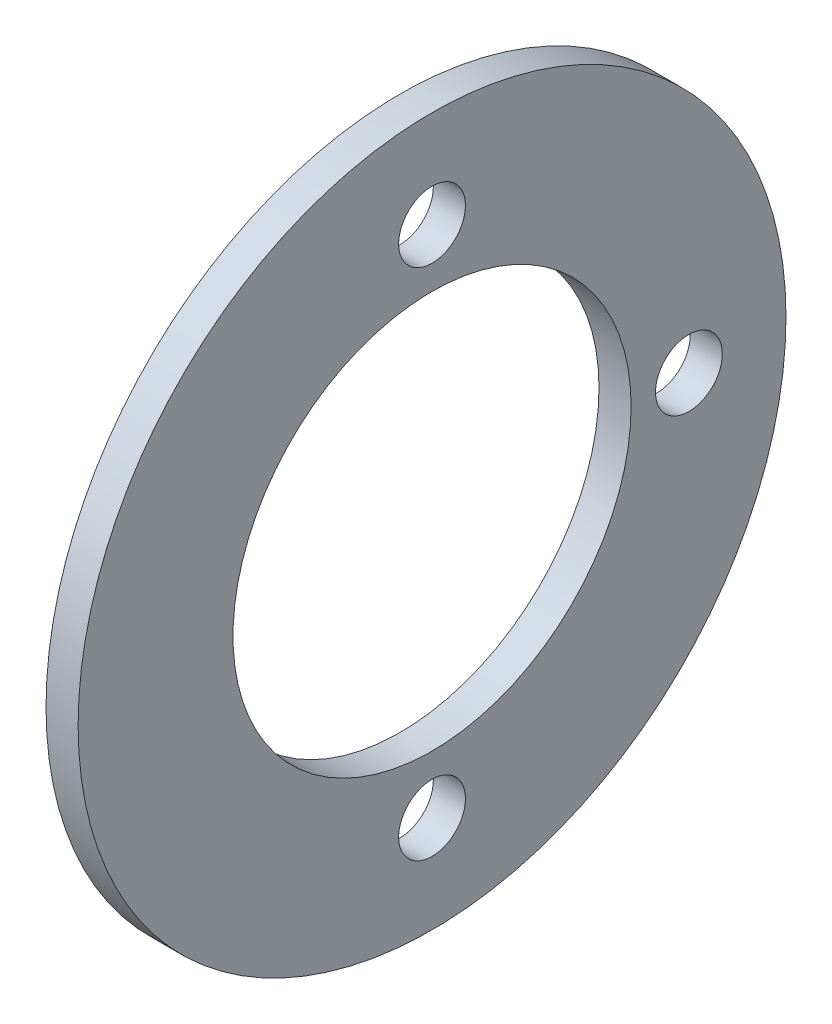
ISO-10303-21;
HEADER;
FILE_DESCRIPTION(('STEP AP214'),'2;1');
FILE_NAME('part.step','',(''),(''),'','','');
FILE_SCHEMA(('AUTOMOTIVE_DESIGN { 1 0 10303 214 1 1 1 1 }'));
ENDSEC;
DATA;
#1=APPLICATION_CONTEXT('core data for automotive mechanical design processes');
#2=APPLICATION_PROTOCOL_DEFINITION('international standard','automotive_design',2000,#1);
#3=PRODUCT_CONTEXT('',#1,'mechanical');
#4=PRODUCT('Part','Part','',(#3));
#5=PRODUCT_RELATED_PRODUCT_CATEGORY('part','',(#4));
#6=PRODUCT_DEFINITION_FORMATION('','',#4);
#7=PRODUCT_DEFINITION_CONTEXT('part definition',#1,'design');
#8=PRODUCT_DEFINITION('design','',#6,#7);
#9=PRODUCT_DEFINITION_SHAPE('','',#8);
#10=(LENGTH_UNIT() NAMED_UNIT(*) SI_UNIT(.MILLI.,.METRE.));
#11=(NAMED_UNIT(*) PLANE_ANGLE_UNIT() SI_UNIT($,.RADIAN.));
#12=(NAMED_UNIT(*) SI_UNIT($,.STERADIAN.) SOLID_ANGLE_UNIT());
#13=UNCERTAINTY_MEASURE_WITH_UNIT(LENGTH_MEASURE(1.E-05),#10,'distance_accuracy_value','');
#14=(GEOMETRIC_REPRESENTATION_CONTEXT(3) GLOBAL_UNCERTAINTY_ASSIGNED_CONTEXT((#13)) GLOBAL_UNIT_ASSIGNED_CONTEXT((#10,
#11,#12)) REPRESENTATION_CONTEXT('',''));
#15=CARTESIAN_POINT('',(0.,0.,0.));
#16=DIRECTION('',(0.,0.,1.));
#17=DIRECTION('',(1.,0.,0.));
#18=AXIS2_PLACEMENT_3D('',#15,#16,#17);
#19=CARTESIAN_POINT('',(3.175,0.,0.));
#20=DIRECTION('',(1.,0.,0.));
#21=DIRECTION('',(0.,0.,-1.));
#22=AXIS2_PLACEMENT_3D('',#19,#20,#21);
#23=PLANE('',#22);
#24=CARTESIAN_POINT('',(3.175,0.,-25.4));
#25=DIRECTION('',(1.,0.,0.));
#26=DIRECTION('',(0.,0.,-1.));
#27=AXIS2_PLACEMENT_3D('',#24,#25,#26);
#28=CIRCLE('',#27,3.302);
#29=CARTESIAN_POINT('',(3.175,0.,-28.702));
#30=VERTEX_POINT('',#29);
#31=EDGE_CURVE('E53',#30,#30,#28,.T.);
#32=ORIENTED_EDGE('',*,*,#31,.F.);
#33=EDGE_LOOP('',(#32));
#34=FACE_BOUND('',#33,.T.);
#35=CARTESIAN_POINT('',(3.175,0.,0.));
#36=DIRECTION('',(1.,0.,0.));
#37=DIRECTION('',(0.,0.,-1.));
#38=AXIS2_PLACEMENT_3D('',#35,#36,#37);
#39=CIRCLE('',#38,19.685);
#40=CARTESIAN_POINT('',(3.175,0.,-19.685));
#41=VERTEX_POINT('',#40);
#42=EDGE_CURVE('E42',#41,#41,#39,.T.);
#43=ORIENTED_EDGE('',*,*,#42,.F.);
#44=EDGE_LOOP('',(#43));
#45=FACE_BOUND('',#44,.T.);
#46=CARTESIAN_POINT('',(3.175,0.,0.));
#47=DIRECTION('',(1.,0.,0.));
#48=DIRECTION('',(0.,0.,-1.));
#49=AXIS2_PLACEMENT_3D('',#46,#47,#48);
#50=CIRCLE('',#49,35.);
#51=CARTESIAN_POINT('',(3.175,0.,-35.));
#52=VERTEX_POINT('',#51);
#53=EDGE_CURVE('E10',#52,#52,#50,.T.);
#54=ORIENTED_EDGE('',*,*,#53,.T.);
#55=EDGE_LOOP('',(#54));
#56=FACE_BOUND('',#55,.T.);
#57=CARTESIAN_POINT('',(3.175,25.4,0.));
#58=DIRECTION('',(1.,0.,0.));
#59=DIRECTION('',(0.,0.,-1.));
#60=AXIS2_PLACEMENT_3D('',#57,#58,#59);
#61=CIRCLE('',#60,3.302);
#62=CARTESIAN_POINT('',(3.175,25.4,-3.302));
#63=VERTEX_POINT('',#62);
#64=EDGE_CURVE('E47',#63,#63,#61,.T.);
#65=ORIENTED_EDGE('',*,*,#64,.F.);
#66=EDGE_LOOP('',(#65));
#67=FACE_BOUND('',#66,.T.);
#68=CARTESIAN_POINT('',(3.175,-25.4,-7.15690213792593E-13));
#69=DIRECTION('',(1.,0.,0.));
#70=DIRECTION('',(0.,0.,-1.));
#71=AXIS2_PLACEMENT_3D('',#68,#69,#70);
#72=CIRCLE('',#71,3.30200000000085);
#73=CARTESIAN_POINT('',(3.175,-25.4,-3.30200000000157));
#74=VERTEX_POINT('',#73);
#75=EDGE_CURVE('E59',#74,#74,#72,.T.);
#76=ORIENTED_EDGE('',*,*,#75,.F.);
#77=EDGE_LOOP('',(#76));
#78=FACE_BOUND('',#77,.T.);
#79=ADVANCED_FACE('F31',(#34,#45,#56,#67,#78),#23,.T.);
#80=CARTESIAN_POINT('',(0.,0.,0.));
#81=DIRECTION('',(1.,0.,0.));
#82=DIRECTION('',(0.,0.,-1.));
#83=AXIS2_PLACEMENT_3D('',#80,#81,#82);
#84=PLANE('',#83);
#85=CARTESIAN_POINT('',(0.,0.,-25.4));
#86=DIRECTION('',(1.,0.,0.));
#87=DIRECTION('',(0.,0.,-1.));
#88=AXIS2_PLACEMENT_3D('',#85,#86,#87);
#89=CIRCLE('',#88,3.302);
#90=CARTESIAN_POINT('',(0.,0.,-28.702));
#91=VERTEX_POINT('',#90);
#92=EDGE_CURVE('E56',#91,#91,#89,.T.);
#93=ORIENTED_EDGE('',*,*,#92,.T.);
#94=EDGE_LOOP('',(#93));
#95=FACE_BOUND('',#94,.T.);
#96=CARTESIAN_POINT('',(0.,0.,0.));
#97=DIRECTION('',(1.,0.,0.));
#98=DIRECTION('',(0.,0.,-1.));
#99=AXIS2_PLACEMENT_3D('',#96,#97,#98);
#100=CIRCLE('',#99,19.685);
#101=CARTESIAN_POINT('',(0.,0.,-19.685));
#102=VERTEX_POINT('',#101);
#103=EDGE_CURVE('E44',#102,#102,#100,.T.);
#104=ORIENTED_EDGE('',*,*,#103,.T.);
#105=EDGE_LOOP('',(#104));
#106=FACE_BOUND('',#105,.T.);
#107=CARTESIAN_POINT('',(0.,0.,0.));
#108=DIRECTION('',(1.,0.,0.));
#109=DIRECTION('',(0.,0.,-1.));
#110=AXIS2_PLACEMENT_3D('',#107,#108,#109);
#111=CIRCLE('',#110,35.);
#112=CARTESIAN_POINT('',(0.,0.,-35.));
#113=VERTEX_POINT('',#112);
#114=EDGE_CURVE('E35',#113,#113,#111,.T.);
#115=ORIENTED_EDGE('',*,*,#114,.F.);
#116=EDGE_LOOP('',(#115));
#117=FACE_BOUND('',#116,.T.);
#118=CARTESIAN_POINT('',(0.,25.4,0.));
#119=DIRECTION('',(1.,0.,0.));
#120=DIRECTION('',(0.,0.,-1.));
#121=AXIS2_PLACEMENT_3D('',#118,#119,#120);
#122=CIRCLE('',#121,3.302);
#123=CARTESIAN_POINT('',(0.,25.4,-3.302));
#124=VERTEX_POINT('',#123);
#125=EDGE_CURVE('E50',#124,#124,#122,.T.);
#126=ORIENTED_EDGE('',*,*,#125,.T.);
#127=EDGE_LOOP('',(#126));
#128=FACE_BOUND('',#127,.T.);
#129=CARTESIAN_POINT('',(0.,-25.4,-7.15690213792593E-13));
#130=DIRECTION('',(1.,0.,0.));
#131=DIRECTION('',(0.,0.,-1.));
#132=AXIS2_PLACEMENT_3D('',#129,#130,#131);
#133=CIRCLE('',#132,3.30200000000085);
#134=CARTESIAN_POINT('',(0.,-25.4,-3.30200000000157));
#135=VERTEX_POINT('',#134);
#136=EDGE_CURVE('E62',#135,#135,#133,.T.);
#137=ORIENTED_EDGE('',*,*,#136,.T.);
#138=EDGE_LOOP('',(#137));
#139=FACE_BOUND('',#138,.T.);
#140=ADVANCED_FACE('F72',(#95,#106,#117,#128,#139),#84,.F.);
#141=CARTESIAN_POINT('',(3.175,0.,0.));
#142=DIRECTION('',(-1.,0.,0.));
#143=DIRECTION('',(0.,0.,1.));
#144=AXIS2_PLACEMENT_3D('',#141,#142,#143);
#145=CYLINDRICAL_SURFACE('',#144,35.);
#146=ORIENTED_EDGE('',*,*,#53,.F.);
#147=EDGE_LOOP('',(#146));
#148=FACE_BOUND('',#147,.T.);
#149=ORIENTED_EDGE('',*,*,#114,.T.);
#150=EDGE_LOOP('',(#149));
#151=FACE_BOUND('',#150,.T.);
#152=ADVANCED_FACE('F33',(#148,#151),#145,.T.);
#153=CARTESIAN_POINT('',(3.175,0.,0.));
#154=DIRECTION('',(-1.,0.,0.));
#155=DIRECTION('',(0.,0.,1.));
#156=AXIS2_PLACEMENT_3D('',#153,#154,#155);
#157=CYLINDRICAL_SURFACE('',#156,19.685);
#158=ORIENTED_EDGE('',*,*,#42,.T.);
#159=EDGE_LOOP('',(#158));
#160=FACE_BOUND('',#159,.T.);
#161=ORIENTED_EDGE('',*,*,#103,.F.);
#162=EDGE_LOOP('',(#161));
#163=FACE_BOUND('',#162,.T.);
#164=ADVANCED_FACE('F82',(#160,#163),#157,.F.);
#165=CARTESIAN_POINT('',(3.175,25.4,0.));
#166=DIRECTION('',(-1.,0.,0.));
#167=DIRECTION('',(0.,0.,1.));
#168=AXIS2_PLACEMENT_3D('',#165,#166,#167);
#169=CYLINDRICAL_SURFACE('',#168,3.302);
#170=ORIENTED_EDGE('',*,*,#64,.T.);
#171=EDGE_LOOP('',(#170));
#172=FACE_BOUND('',#171,.T.);
#173=ORIENTED_EDGE('',*,*,#125,.F.);
#174=EDGE_LOOP('',(#173));
#175=FACE_BOUND('',#174,.T.);
#176=ADVANCED_FACE('F85',(#172,#175),#169,.F.);
#177=CARTESIAN_POINT('',(3.175,0.,-25.4));
#178=DIRECTION('',(-1.,0.,0.));
#179=DIRECTION('',(0.,0.,1.));
#180=AXIS2_PLACEMENT_3D('',#177,#178,#179);
#181=CYLINDRICAL_SURFACE('',#180,3.302);
#182=ORIENTED_EDGE('',*,*,#31,.T.);
#183=EDGE_LOOP('',(#182));
#184=FACE_BOUND('',#183,.T.);
#185=ORIENTED_EDGE('',*,*,#92,.F.);
#186=EDGE_LOOP('',(#185));
#187=FACE_BOUND('',#186,.T.);
#188=ADVANCED_FACE('F89',(#184,#187),#181,.F.);
#189=CARTESIAN_POINT('',(3.175,-25.4,-7.15690213792593E-13));
#190=DIRECTION('',(-1.,0.,0.));
#191=DIRECTION('',(0.,0.,1.));
#192=AXIS2_PLACEMENT_3D('',#189,#190,#191);
#193=CYLINDRICAL_SURFACE('',#192,3.30200000000085);
#194=ORIENTED_EDGE('',*,*,#75,.T.);
#195=EDGE_LOOP('',(#194));
#196=FACE_BOUND('',#195,.T.);
#197=ORIENTED_EDGE('',*,*,#136,.F.);
#198=EDGE_LOOP('',(#197));
#199=FACE_BOUND('',#198,.T.);
#200=ADVANCED_FACE('F68',(#196,#199),#193,.F.);
#201=CLOSED_SHELL('',(#79,#140,#152,#164,#176,#188,#200));
#202=MANIFOLD_SOLID_BREP('B2',#201);
#203=ADVANCED_BREP_SHAPE_REPRESENTATION('',(#18,#202),#14);
#204=SHAPE_DEFINITION_REPRESENTATION(#9,#203);
ENDSEC;
END-ISO-10303-21;
